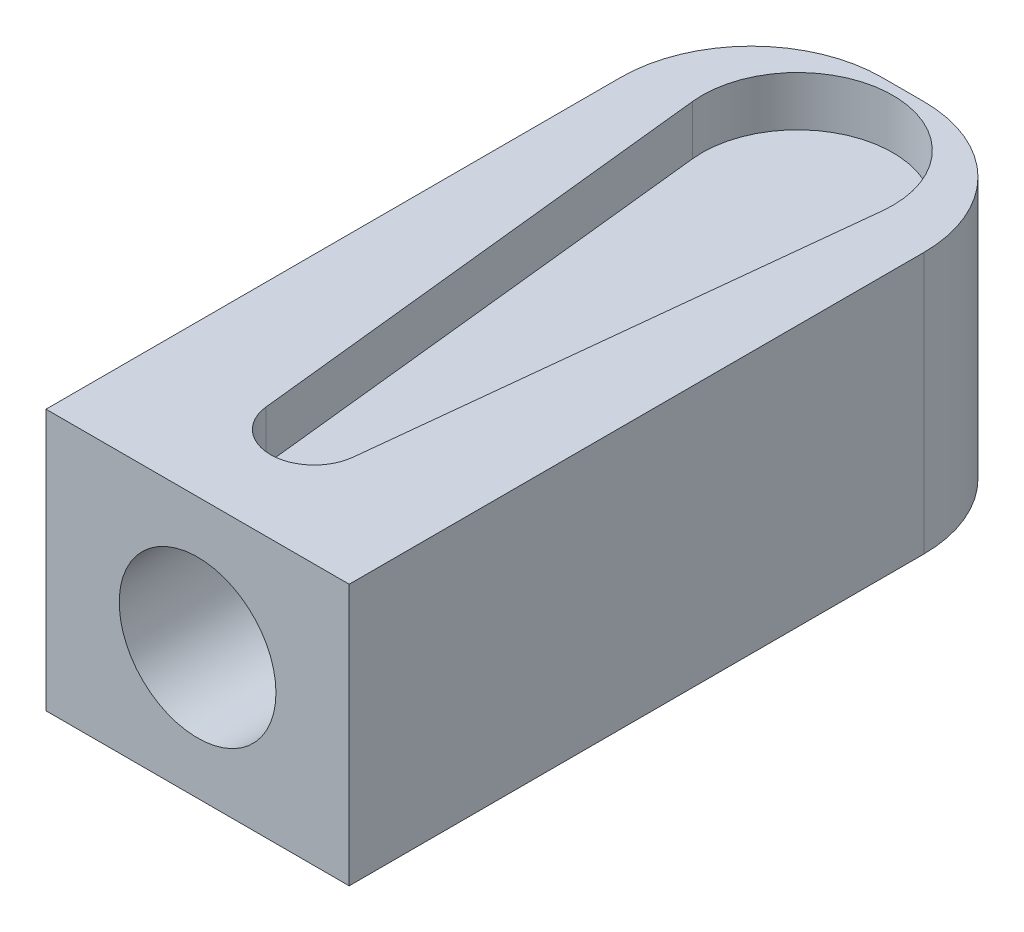
ISO-10303-21;
HEADER;
FILE_DESCRIPTION(('STEP AP214'),'2;1');
FILE_NAME('part.step','',(''),(''),'','','');
FILE_SCHEMA(('AUTOMOTIVE_DESIGN { 1 0 10303 214 1 1 1 1 }'));
ENDSEC;
DATA;
#1=APPLICATION_CONTEXT('core data for automotive mechanical design processes');
#2=APPLICATION_PROTOCOL_DEFINITION('international standard','automotive_design',2000,#1);
#3=PRODUCT_CONTEXT('',#1,'mechanical');
#4=PRODUCT('Part','Part','',(#3));
#5=PRODUCT_RELATED_PRODUCT_CATEGORY('part','',(#4));
#6=PRODUCT_DEFINITION_FORMATION('','',#4);
#7=PRODUCT_DEFINITION_CONTEXT('part definition',#1,'design');
#8=PRODUCT_DEFINITION('design','',#6,#7);
#9=PRODUCT_DEFINITION_SHAPE('','',#8);
#10=(LENGTH_UNIT() NAMED_UNIT(*) SI_UNIT(.MILLI.,.METRE.));
#11=(NAMED_UNIT(*) PLANE_ANGLE_UNIT() SI_UNIT($,.RADIAN.));
#12=(NAMED_UNIT(*) SI_UNIT($,.STERADIAN.) SOLID_ANGLE_UNIT());
#13=UNCERTAINTY_MEASURE_WITH_UNIT(LENGTH_MEASURE(1.E-05),#10,'distance_accuracy_value','');
#14=(GEOMETRIC_REPRESENTATION_CONTEXT(3) GLOBAL_UNCERTAINTY_ASSIGNED_CONTEXT((#13)) GLOBAL_UNIT_ASSIGNED_CONTEXT((#10,
#11,#12)) REPRESENTATION_CONTEXT('',''));
#15=CARTESIAN_POINT('',(0.,0.,0.));
#16=DIRECTION('',(0.,0.,1.));
#17=DIRECTION('',(1.,0.,0.));
#18=AXIS2_PLACEMENT_3D('',#15,#16,#17);
#19=CARTESIAN_POINT('',(0.,0.,25.));
#20=DIRECTION('',(0.,0.,-1.));
#21=DIRECTION('',(-1.,0.,0.));
#22=AXIS2_PLACEMENT_3D('',#19,#20,#21);
#23=PLANE('',#22);
#24=DIRECTION('',(0.,1.,0.));
#25=VECTOR('',#24,1.);
#26=CARTESIAN_POINT('',(5.80298803169643,-5.,25.));
#27=LINE('',#26,#25);
#28=CARTESIAN_POINT('',(5.80298803169643,-5.,25.));
#29=VERTEX_POINT('',#28);
#30=CARTESIAN_POINT('',(5.80298803169643,5.,25.));
#31=VERTEX_POINT('',#30);
#32=EDGE_CURVE('E186',#29,#31,#27,.T.);
#33=ORIENTED_EDGE('',*,*,#32,.T.);
#34=DIRECTION('',(-1.,0.,0.));
#35=VECTOR('',#34,1.);
#36=CARTESIAN_POINT('',(-5.80298803169643,5.,25.));
#37=LINE('',#36,#35);
#38=CARTESIAN_POINT('',(-5.80298803169643,5.,25.));
#39=VERTEX_POINT('',#38);
#40=EDGE_CURVE('E193',#31,#39,#37,.T.);
#41=ORIENTED_EDGE('',*,*,#40,.T.);
#42=DIRECTION('',(0.,-1.,0.));
#43=VECTOR('',#42,1.);
#44=CARTESIAN_POINT('',(-5.80298803169643,-5.,25.));
#45=LINE('',#44,#43);
#46=CARTESIAN_POINT('',(-5.80298803169643,-5.,25.));
#47=VERTEX_POINT('',#46);
#48=EDGE_CURVE('E196',#39,#47,#45,.T.);
#49=ORIENTED_EDGE('',*,*,#48,.T.);
#50=DIRECTION('',(1.,0.,0.));
#51=VECTOR('',#50,1.);
#52=CARTESIAN_POINT('',(-5.80298803169643,-5.,25.));
#53=LINE('',#52,#51);
#54=EDGE_CURVE('E199',#47,#29,#53,.T.);
#55=ORIENTED_EDGE('',*,*,#54,.T.);
#56=EDGE_LOOP('',(#33,#41,#49,#55));
#57=FACE_BOUND('',#56,.T.);
#58=CARTESIAN_POINT('',(0.,0.,25.));
#59=DIRECTION('',(0.,0.,1.));
#60=DIRECTION('',(1.,0.,0.));
#61=AXIS2_PLACEMENT_3D('',#58,#59,#60);
#62=CIRCLE('',#61,3.);
#63=CARTESIAN_POINT('',(3.,0.,25.));
#64=VERTEX_POINT('',#63);
#65=EDGE_CURVE('E182',#64,#64,#62,.T.);
#66=ORIENTED_EDGE('',*,*,#65,.F.);
#67=EDGE_LOOP('',(#66));
#68=FACE_BOUND('',#67,.T.);
#69=ADVANCED_FACE('F45',(#57,#68),#23,.F.);
#70=CARTESIAN_POINT('',(5.80298803169643,-5.,25.));
#71=DIRECTION('',(-1.,0.,0.));
#72=DIRECTION('',(0.,0.,1.));
#73=AXIS2_PLACEMENT_3D('',#70,#71,#72);
#74=PLANE('',#73);
#75=DIRECTION('',(0.,0.,-1.));
#76=VECTOR('',#75,1.);
#77=CARTESIAN_POINT('',(5.80298803169643,-5.,25.));
#78=LINE('',#77,#76);
#79=CARTESIAN_POINT('',(5.80298803169643,-5.,3.));
#80=VERTEX_POINT('',#79);
#81=EDGE_CURVE('E202',#29,#80,#78,.T.);
#82=ORIENTED_EDGE('',*,*,#81,.T.);
#83=DIRECTION('',(0.,-1.,0.));
#84=VECTOR('',#83,1.);
#85=CARTESIAN_POINT('',(5.80298803169643,5.,3.));
#86=LINE('',#85,#84);
#87=CARTESIAN_POINT('',(5.80298803169643,5.,3.));
#88=VERTEX_POINT('',#87);
#89=EDGE_CURVE('E11',#80,#88,#86,.F.);
#90=ORIENTED_EDGE('',*,*,#89,.T.);
#91=DIRECTION('',(0.,0.,-1.));
#92=VECTOR('',#91,1.);
#93=CARTESIAN_POINT('',(5.80298803169643,5.,25.));
#94=LINE('',#93,#92);
#95=EDGE_CURVE('E213',#31,#88,#94,.T.);
#96=ORIENTED_EDGE('',*,*,#95,.F.);
#97=ORIENTED_EDGE('',*,*,#32,.F.);
#98=EDGE_LOOP('',(#82,#90,#96,#97));
#99=FACE_BOUND('',#98,.T.);
#100=ADVANCED_FACE('F262',(#99),#74,.F.);
#101=CARTESIAN_POINT('',(-5.80298803169643,5.,25.));
#102=DIRECTION('',(0.,-1.,0.));
#103=DIRECTION('',(0.,0.,-1.));
#104=AXIS2_PLACEMENT_3D('',#101,#102,#103);
#105=PLANE('',#104);
#106=DIRECTION('',(0.106756756756757,0.,0.994285167789794));
#107=VECTOR('',#106,1.);
#108=CARTESIAN_POINT('',(-3.62914086243275,5.,2.42482766453953));
#109=LINE('',#108,#107);
#110=CARTESIAN_POINT('',(-3.62914086243275,5.,2.42482766453953));
#111=VERTEX_POINT('',#110);
#112=CARTESIAN_POINT('',(-1.6654276560479,5.,20.7139830699449));
#113=VERTEX_POINT('',#112);
#114=EDGE_CURVE('E159',#111,#113,#109,.T.);
#115=ORIENTED_EDGE('',*,*,#114,.F.);
#116=CARTESIAN_POINT('',(0.,5.,2.03516550237737));
#117=DIRECTION('',(0.,1.,0.));
#118=DIRECTION('',(0.,0.,1.));
#119=AXIS2_PLACEMENT_3D('',#116,#117,#118);
#120=CIRCLE('',#119,3.65);
#121=CARTESIAN_POINT('',(3.62914086243275,5.,2.42482766453953));
#122=VERTEX_POINT('',#121);
#123=EDGE_CURVE('E61',#122,#111,#120,.T.);
#124=ORIENTED_EDGE('',*,*,#123,.F.);
#125=DIRECTION('',(0.106756756756757,0.,-0.994285167789794));
#126=VECTOR('',#125,1.);
#127=CARTESIAN_POINT('',(3.62914086243275,5.,2.42482766453953));
#128=LINE('',#127,#126);
#129=CARTESIAN_POINT('',(1.66542765604791,5.,20.7139830699449));
#130=VERTEX_POINT('',#129);
#131=EDGE_CURVE('E146',#130,#122,#128,.T.);
#132=ORIENTED_EDGE('',*,*,#131,.F.);
#133=CARTESIAN_POINT('',(0.,5.,20.5351655023774));
#134=DIRECTION('',(0.,1.,0.));
#135=DIRECTION('',(0.,0.,1.));
#136=AXIS2_PLACEMENT_3D('',#133,#134,#135);
#137=CIRCLE('',#136,1.675);
#138=EDGE_CURVE('E150',#113,#130,#137,.T.);
#139=ORIENTED_EDGE('',*,*,#138,.F.);
#140=EDGE_LOOP('',(#115,#124,#132,#139));
#141=FACE_BOUND('',#140,.T.);
#142=DIRECTION('',(1.,0.,0.));
#143=VECTOR('',#142,1.);
#144=CARTESIAN_POINT('',(-5.80298803169643,5.,-2.));
#145=LINE('',#144,#143);
#146=CARTESIAN_POINT('',(-0.802988031696428,5.,-2.));
#147=VERTEX_POINT('',#146);
#148=CARTESIAN_POINT('',(0.80298803169643,5.,-2.));
#149=VERTEX_POINT('',#148);
#150=EDGE_CURVE('E168',#147,#149,#145,.T.);
#151=ORIENTED_EDGE('',*,*,#150,.F.);
#152=CARTESIAN_POINT('',(-0.802988031696428,5.,3.));
#153=DIRECTION('',(0.,-1.,0.));
#154=DIRECTION('',(0.,0.,-1.));
#155=AXIS2_PLACEMENT_3D('',#152,#153,#154);
#156=CIRCLE('',#155,5.);
#157=CARTESIAN_POINT('',(-5.80298803169643,5.,3.));
#158=VERTEX_POINT('',#157);
#159=EDGE_CURVE('E228',#147,#158,#156,.F.);
#160=ORIENTED_EDGE('',*,*,#159,.T.);
#161=DIRECTION('',(0.,0.,-1.));
#162=VECTOR('',#161,1.);
#163=CARTESIAN_POINT('',(-5.80298803169643,5.,25.));
#164=LINE('',#163,#162);
#165=EDGE_CURVE('E209',#39,#158,#164,.T.);
#166=ORIENTED_EDGE('',*,*,#165,.F.);
#167=ORIENTED_EDGE('',*,*,#40,.F.);
#168=ORIENTED_EDGE('',*,*,#95,.T.);
#169=CARTESIAN_POINT('',(0.80298803169643,5.,3.));
#170=DIRECTION('',(0.,-1.,0.));
#171=DIRECTION('',(0.,0.,-1.));
#172=AXIS2_PLACEMENT_3D('',#169,#170,#171);
#173=CIRCLE('',#172,5.);
#174=EDGE_CURVE('E225',#88,#149,#173,.F.);
#175=ORIENTED_EDGE('',*,*,#174,.T.);
#176=EDGE_LOOP('',(#151,#160,#166,#167,#168,#175));
#177=FACE_BOUND('',#176,.T.);
#178=ADVANCED_FACE('F250',(#141,#177),#105,.F.);
#179=CARTESIAN_POINT('',(-5.80298803169643,-5.,25.));
#180=DIRECTION('',(1.,0.,0.));
#181=DIRECTION('',(0.,0.,-1.));
#182=AXIS2_PLACEMENT_3D('',#179,#180,#181);
#183=PLANE('',#182);
#184=ORIENTED_EDGE('',*,*,#165,.T.);
#185=DIRECTION('',(0.,1.,0.));
#186=VECTOR('',#185,1.);
#187=CARTESIAN_POINT('',(-5.80298803169643,-5.,3.));
#188=LINE('',#187,#186);
#189=CARTESIAN_POINT('',(-5.80298803169643,-5.,3.));
#190=VERTEX_POINT('',#189);
#191=EDGE_CURVE('E231',#158,#190,#188,.F.);
#192=ORIENTED_EDGE('',*,*,#191,.T.);
#193=DIRECTION('',(0.,0.,-1.));
#194=VECTOR('',#193,1.);
#195=CARTESIAN_POINT('',(-5.80298803169643,-5.,25.));
#196=LINE('',#195,#194);
#197=EDGE_CURVE('E205',#47,#190,#196,.T.);
#198=ORIENTED_EDGE('',*,*,#197,.F.);
#199=ORIENTED_EDGE('',*,*,#48,.F.);
#200=EDGE_LOOP('',(#184,#192,#198,#199));
#201=FACE_BOUND('',#200,.T.);
#202=ADVANCED_FACE('F253',(#201),#183,.F.);
#203=CARTESIAN_POINT('',(-5.80298803169643,-5.,25.));
#204=DIRECTION('',(0.,1.,0.));
#205=DIRECTION('',(0.,0.,1.));
#206=AXIS2_PLACEMENT_3D('',#203,#204,#205);
#207=PLANE('',#206);
#208=ORIENTED_EDGE('',*,*,#197,.T.);
#209=CARTESIAN_POINT('',(-0.802988031696428,-5.,3.));
#210=DIRECTION('',(0.,1.,0.));
#211=DIRECTION('',(0.,0.,1.));
#212=AXIS2_PLACEMENT_3D('',#209,#210,#211);
#213=CIRCLE('',#212,5.);
#214=CARTESIAN_POINT('',(-0.802988031696428,-5.,-2.));
#215=VERTEX_POINT('',#214);
#216=EDGE_CURVE('E54',#190,#215,#213,.F.);
#217=ORIENTED_EDGE('',*,*,#216,.T.);
#218=DIRECTION('',(-1.,0.,0.));
#219=VECTOR('',#218,1.);
#220=CARTESIAN_POINT('',(5.80298803169643,-5.,-2.));
#221=LINE('',#220,#219);
#222=CARTESIAN_POINT('',(0.80298803169643,-5.,-2.));
#223=VERTEX_POINT('',#222);
#224=EDGE_CURVE('E177',#223,#215,#221,.T.);
#225=ORIENTED_EDGE('',*,*,#224,.F.);
#226=CARTESIAN_POINT('',(0.80298803169643,-5.,3.));
#227=DIRECTION('',(0.,1.,0.));
#228=DIRECTION('',(0.,0.,1.));
#229=AXIS2_PLACEMENT_3D('',#226,#227,#228);
#230=CIRCLE('',#229,5.);
#231=EDGE_CURVE('E69',#223,#80,#230,.F.);
#232=ORIENTED_EDGE('',*,*,#231,.T.);
#233=ORIENTED_EDGE('',*,*,#81,.F.);
#234=ORIENTED_EDGE('',*,*,#54,.F.);
#235=EDGE_LOOP('',(#208,#217,#225,#232,#233,#234));
#236=FACE_BOUND('',#235,.T.);
#237=ADVANCED_FACE('F237',(#236),#207,.F.);
#238=CARTESIAN_POINT('',(0.,0.,25.));
#239=DIRECTION('',(0.,0.,-1.));
#240=DIRECTION('',(-1.,0.,0.));
#241=AXIS2_PLACEMENT_3D('',#238,#239,#240);
#242=CYLINDRICAL_SURFACE('',#241,3.);
#243=ORIENTED_EDGE('',*,*,#65,.T.);
#244=EDGE_LOOP('',(#243));
#245=FACE_BOUND('',#244,.T.);
#246=CARTESIAN_POINT('',(0.,0.,0.));
#247=DIRECTION('',(0.,0.,1.));
#248=DIRECTION('',(1.,0.,0.));
#249=AXIS2_PLACEMENT_3D('',#246,#247,#248);
#250=CIRCLE('',#249,3.);
#251=CARTESIAN_POINT('',(3.,0.,0.));
#252=VERTEX_POINT('',#251);
#253=EDGE_CURVE('E181',#252,#252,#250,.T.);
#254=ORIENTED_EDGE('',*,*,#253,.F.);
#255=EDGE_LOOP('',(#254));
#256=FACE_BOUND('',#255,.T.);
#257=ADVANCED_FACE('F283',(#245,#256),#242,.F.);
#258=CARTESIAN_POINT('',(0.,0.,0.));
#259=DIRECTION('',(0.,0.,-1.));
#260=DIRECTION('',(-1.,0.,0.));
#261=AXIS2_PLACEMENT_3D('',#258,#259,#260);
#262=PLANE('',#261);
#263=ORIENTED_EDGE('',*,*,#253,.T.);
#264=EDGE_LOOP('',(#263));
#265=FACE_BOUND('',#264,.T.);
#266=ADVANCED_FACE('F278',(#265),#262,.F.);
#267=CARTESIAN_POINT('',(0.,0.,-2.));
#268=DIRECTION('',(0.,0.,-1.));
#269=DIRECTION('',(-1.,0.,0.));
#270=AXIS2_PLACEMENT_3D('',#267,#268,#269);
#271=PLANE('',#270);
#272=ORIENTED_EDGE('',*,*,#224,.T.);
#273=DIRECTION('',(0.,1.,0.));
#274=VECTOR('',#273,1.);
#275=CARTESIAN_POINT('',(-0.802988031696428,5.,-2.));
#276=LINE('',#275,#274);
#277=EDGE_CURVE('E221',#215,#147,#276,.T.);
#278=ORIENTED_EDGE('',*,*,#277,.T.);
#279=ORIENTED_EDGE('',*,*,#150,.T.);
#280=DIRECTION('',(0.,-1.,0.));
#281=VECTOR('',#280,1.);
#282=CARTESIAN_POINT('',(0.80298803169643,-5.,-2.));
#283=LINE('',#282,#281);
#284=EDGE_CURVE('E217',#149,#223,#283,.T.);
#285=ORIENTED_EDGE('',*,*,#284,.T.);
#286=EDGE_LOOP('',(#272,#278,#279,#285));
#287=FACE_BOUND('',#286,.T.);
#288=ADVANCED_FACE('F244',(#287),#271,.T.);
#289=CARTESIAN_POINT('',(-0.802988031696428,0.,3.));
#290=DIRECTION('',(0.,-1.,0.));
#291=DIRECTION('',(0.,0.,-1.));
#292=AXIS2_PLACEMENT_3D('',#289,#290,#291);
#293=CYLINDRICAL_SURFACE('',#292,5.);
#294=ORIENTED_EDGE('',*,*,#216,.F.);
#295=ORIENTED_EDGE('',*,*,#191,.F.);
#296=ORIENTED_EDGE('',*,*,#159,.F.);
#297=ORIENTED_EDGE('',*,*,#277,.F.);
#298=EDGE_LOOP('',(#294,#295,#296,#297));
#299=FACE_BOUND('',#298,.T.);
#300=ADVANCED_FACE('F247',(#299),#293,.T.);
#301=CARTESIAN_POINT('',(0.80298803169643,0.,3.));
#302=DIRECTION('',(0.,1.,0.));
#303=DIRECTION('',(0.,0.,1.));
#304=AXIS2_PLACEMENT_3D('',#301,#302,#303);
#305=CYLINDRICAL_SURFACE('',#304,5.);
#306=ORIENTED_EDGE('',*,*,#174,.F.);
#307=ORIENTED_EDGE('',*,*,#89,.F.);
#308=ORIENTED_EDGE('',*,*,#231,.F.);
#309=ORIENTED_EDGE('',*,*,#284,.F.);
#310=EDGE_LOOP('',(#306,#307,#308,#309));
#311=FACE_BOUND('',#310,.T.);
#312=ADVANCED_FACE('F47',(#311),#305,.T.);
#313=CARTESIAN_POINT('',(0.,3.1,2.03516550237737));
#314=DIRECTION('',(0.,1.,0.));
#315=DIRECTION('',(0.,0.,1.));
#316=AXIS2_PLACEMENT_3D('',#313,#314,#315);
#317=CYLINDRICAL_SURFACE('',#316,3.65);
#318=ORIENTED_EDGE('',*,*,#123,.T.);
#319=DIRECTION('',(0.,1.,0.));
#320=VECTOR('',#319,1.);
#321=CARTESIAN_POINT('',(-3.62914086243275,3.1,2.42482766453953));
#322=LINE('',#321,#320);
#323=CARTESIAN_POINT('',(-3.62914086243275,3.1,2.42482766453953));
#324=VERTEX_POINT('',#323);
#325=EDGE_CURVE('E121',#324,#111,#322,.T.);
#326=ORIENTED_EDGE('',*,*,#325,.F.);
#327=CARTESIAN_POINT('',(0.,3.1,2.03516550237737));
#328=DIRECTION('',(0.,1.,0.));
#329=DIRECTION('',(0.,0.,1.));
#330=AXIS2_PLACEMENT_3D('',#327,#328,#329);
#331=CIRCLE('',#330,3.65);
#332=CARTESIAN_POINT('',(3.62914086243275,3.1,2.42482766453953));
#333=VERTEX_POINT('',#332);
#334=EDGE_CURVE('E125',#333,#324,#331,.T.);
#335=ORIENTED_EDGE('',*,*,#334,.F.);
#336=DIRECTION('',(0.,1.,0.));
#337=VECTOR('',#336,1.);
#338=CARTESIAN_POINT('',(3.62914086243275,3.1,2.42482766453953));
#339=LINE('',#338,#337);
#340=EDGE_CURVE('E165',#333,#122,#339,.T.);
#341=ORIENTED_EDGE('',*,*,#340,.T.);
#342=EDGE_LOOP('',(#318,#326,#335,#341));
#343=FACE_BOUND('',#342,.T.);
#344=ADVANCED_FACE('F123',(#343),#317,.F.);
#345=CARTESIAN_POINT('',(3.62914086243275,3.1,2.42482766453953));
#346=DIRECTION('',(0.994285167789794,0.,0.106756756756757));
#347=DIRECTION('',(0.106756756756757,0.,-0.994285167789794));
#348=AXIS2_PLACEMENT_3D('',#345,#346,#347);
#349=PLANE('',#348);
#350=ORIENTED_EDGE('',*,*,#131,.T.);
#351=ORIENTED_EDGE('',*,*,#340,.F.);
#352=DIRECTION('',(0.106756756756757,0.,-0.994285167789794));
#353=VECTOR('',#352,1.);
#354=CARTESIAN_POINT('',(3.62914086243275,3.1,2.42482766453953));
#355=LINE('',#354,#353);
#356=CARTESIAN_POINT('',(1.66542765604791,3.1,20.7139830699449));
#357=VERTEX_POINT('',#356);
#358=EDGE_CURVE('E132',#357,#333,#355,.T.);
#359=ORIENTED_EDGE('',*,*,#358,.F.);
#360=DIRECTION('',(0.,1.,0.));
#361=VECTOR('',#360,1.);
#362=CARTESIAN_POINT('',(1.66542765604791,3.1,20.7139830699449));
#363=LINE('',#362,#361);
#364=EDGE_CURVE('E169',#357,#130,#363,.T.);
#365=ORIENTED_EDGE('',*,*,#364,.T.);
#366=EDGE_LOOP('',(#350,#351,#359,#365));
#367=FACE_BOUND('',#366,.T.);
#368=ADVANCED_FACE('F335',(#367),#349,.F.);
#369=CARTESIAN_POINT('',(0.,3.1,20.5351655023774));
#370=DIRECTION('',(0.,1.,0.));
#371=DIRECTION('',(0.,0.,1.));
#372=AXIS2_PLACEMENT_3D('',#369,#370,#371);
#373=CYLINDRICAL_SURFACE('',#372,1.675);
#374=ORIENTED_EDGE('',*,*,#138,.T.);
#375=ORIENTED_EDGE('',*,*,#364,.F.);
#376=CARTESIAN_POINT('',(0.,3.1,20.5351655023774));
#377=DIRECTION('',(0.,1.,0.));
#378=DIRECTION('',(0.,0.,1.));
#379=AXIS2_PLACEMENT_3D('',#376,#377,#378);
#380=CIRCLE('',#379,1.675);
#381=CARTESIAN_POINT('',(-1.6654276560479,3.1,20.7139830699449));
#382=VERTEX_POINT('',#381);
#383=EDGE_CURVE('E141',#382,#357,#380,.T.);
#384=ORIENTED_EDGE('',*,*,#383,.F.);
#385=DIRECTION('',(0.,1.,0.));
#386=VECTOR('',#385,1.);
#387=CARTESIAN_POINT('',(-1.6654276560479,3.1,20.7139830699449));
#388=LINE('',#387,#386);
#389=EDGE_CURVE('E131',#382,#113,#388,.T.);
#390=ORIENTED_EDGE('',*,*,#389,.T.);
#391=EDGE_LOOP('',(#374,#375,#384,#390));
#392=FACE_BOUND('',#391,.T.);
#393=ADVANCED_FACE('F343',(#392),#373,.F.);
#394=CARTESIAN_POINT('',(-3.62914086243275,3.1,2.42482766453953));
#395=DIRECTION('',(-0.994285167789794,0.,0.106756756756757));
#396=DIRECTION('',(0.106756756756757,0.,0.994285167789794));
#397=AXIS2_PLACEMENT_3D('',#394,#395,#396);
#398=PLANE('',#397);
#399=ORIENTED_EDGE('',*,*,#114,.T.);
#400=ORIENTED_EDGE('',*,*,#389,.F.);
#401=DIRECTION('',(0.106756756756757,0.,0.994285167789794));
#402=VECTOR('',#401,1.);
#403=CARTESIAN_POINT('',(-3.62914086243275,3.1,2.42482766453953));
#404=LINE('',#403,#402);
#405=EDGE_CURVE('E135',#324,#382,#404,.T.);
#406=ORIENTED_EDGE('',*,*,#405,.F.);
#407=ORIENTED_EDGE('',*,*,#325,.T.);
#408=EDGE_LOOP('',(#399,#400,#406,#407));
#409=FACE_BOUND('',#408,.T.);
#410=ADVANCED_FACE('F136',(#409),#398,.F.);
#411=CARTESIAN_POINT('',(0.,3.1,2.03516550237737));
#412=DIRECTION('',(0.,1.,0.));
#413=DIRECTION('',(0.,0.,1.));
#414=AXIS2_PLACEMENT_3D('',#411,#412,#413);
#415=PLANE('',#414);
#416=ORIENTED_EDGE('',*,*,#334,.T.);
#417=ORIENTED_EDGE('',*,*,#405,.T.);
#418=ORIENTED_EDGE('',*,*,#383,.T.);
#419=ORIENTED_EDGE('',*,*,#358,.T.);
#420=EDGE_LOOP('',(#416,#417,#418,#419));
#421=FACE_BOUND('',#420,.T.);
#422=ADVANCED_FACE('F143',(#421),#415,.T.);
#423=CLOSED_SHELL('',(#69,#100,#178,#202,#237,#257,#266,#288,#300,#312,#344,#368,#393,#410,#422));
#424=MANIFOLD_SOLID_BREP('B2',#423);
#425=ADVANCED_BREP_SHAPE_REPRESENTATION('',(#18,#424),#14);
#426=SHAPE_DEFINITION_REPRESENTATION(#9,#425);
ENDSEC;
END-ISO-10303-21;
